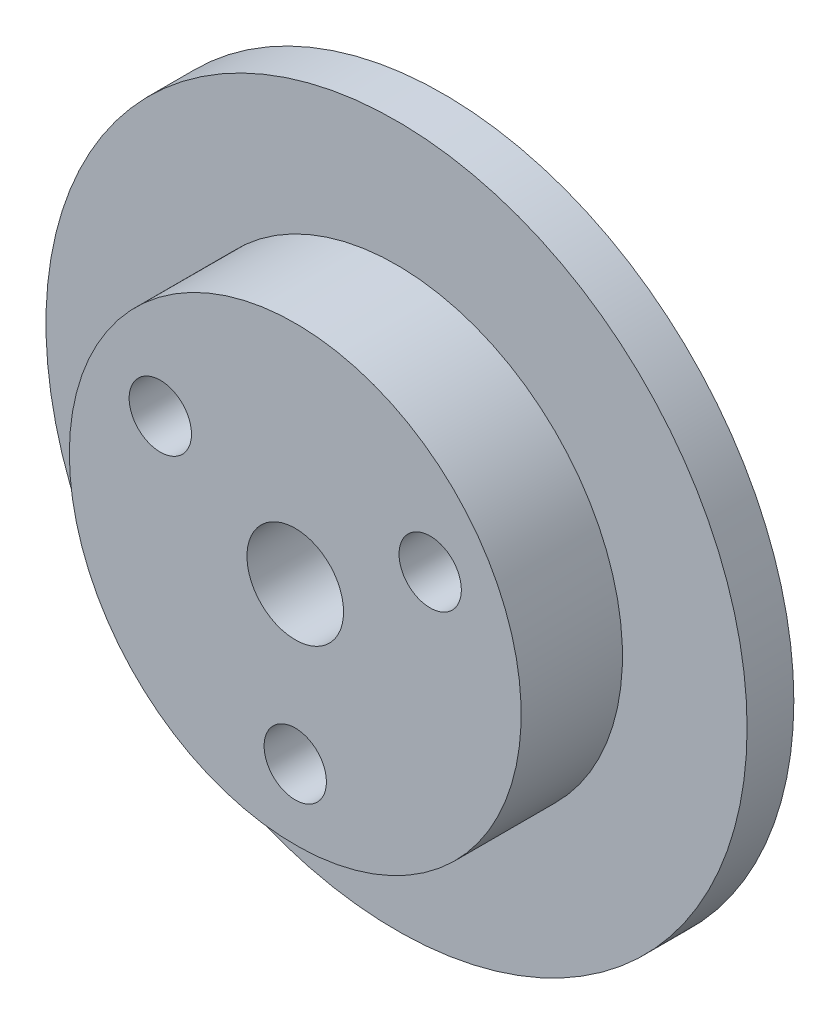
ISO-10303-21;
HEADER;
FILE_DESCRIPTION(('STEP AP214'),'2;1');
FILE_NAME('part.step','',(''),(''),'','','');
FILE_SCHEMA(('AUTOMOTIVE_DESIGN { 1 0 10303 214 1 1 1 1 }'));
ENDSEC;
DATA;
#1=APPLICATION_CONTEXT('core data for automotive mechanical design processes');
#2=APPLICATION_PROTOCOL_DEFINITION('international standard','automotive_design',2000,#1);
#3=PRODUCT_CONTEXT('',#1,'mechanical');
#4=PRODUCT('Part','Part','',(#3));
#5=PRODUCT_RELATED_PRODUCT_CATEGORY('part','',(#4));
#6=PRODUCT_DEFINITION_FORMATION('','',#4);
#7=PRODUCT_DEFINITION_CONTEXT('part definition',#1,'design');
#8=PRODUCT_DEFINITION('design','',#6,#7);
#9=PRODUCT_DEFINITION_SHAPE('','',#8);
#10=(LENGTH_UNIT() NAMED_UNIT(*) SI_UNIT(.MILLI.,.METRE.));
#11=(NAMED_UNIT(*) PLANE_ANGLE_UNIT() SI_UNIT($,.RADIAN.));
#12=(NAMED_UNIT(*) SI_UNIT($,.STERADIAN.) SOLID_ANGLE_UNIT());
#13=UNCERTAINTY_MEASURE_WITH_UNIT(LENGTH_MEASURE(1.E-05),#10,'distance_accuracy_value','');
#14=(GEOMETRIC_REPRESENTATION_CONTEXT(3) GLOBAL_UNCERTAINTY_ASSIGNED_CONTEXT((#13)) GLOBAL_UNIT_ASSIGNED_CONTEXT((#10,
#11,#12)) REPRESENTATION_CONTEXT('',''));
#15=CARTESIAN_POINT('',(0.,0.,0.));
#16=DIRECTION('',(0.,0.,1.));
#17=DIRECTION('',(1.,0.,0.));
#18=AXIS2_PLACEMENT_3D('',#15,#16,#17);
#19=CARTESIAN_POINT('',(0.,0.,3.));
#20=DIRECTION('',(0.,0.,-1.));
#21=DIRECTION('',(-1.,0.,0.));
#22=AXIS2_PLACEMENT_3D('',#19,#20,#21);
#23=CYLINDRICAL_SURFACE('',#22,22.5);
#24=CARTESIAN_POINT('',(0.,0.,3.));
#25=DIRECTION('',(0.,0.,1.));
#26=DIRECTION('',(1.,0.,0.));
#27=AXIS2_PLACEMENT_3D('',#24,#25,#26);
#28=CIRCLE('',#27,22.5);
#29=CARTESIAN_POINT('',(22.5,0.,3.));
#30=VERTEX_POINT('',#29);
#31=EDGE_CURVE('E10',#30,#30,#28,.T.);
#32=ORIENTED_EDGE('',*,*,#31,.F.);
#33=EDGE_LOOP('',(#32));
#34=FACE_BOUND('',#33,.T.);
#35=CARTESIAN_POINT('',(0.,0.,0.));
#36=DIRECTION('',(0.,0.,1.));
#37=DIRECTION('',(1.,0.,0.));
#38=AXIS2_PLACEMENT_3D('',#35,#36,#37);
#39=CIRCLE('',#38,22.5);
#40=CARTESIAN_POINT('',(22.5,0.,0.));
#41=VERTEX_POINT('',#40);
#42=EDGE_CURVE('E34',#41,#41,#39,.T.);
#43=ORIENTED_EDGE('',*,*,#42,.T.);
#44=EDGE_LOOP('',(#43));
#45=FACE_BOUND('',#44,.T.);
#46=ADVANCED_FACE('F31',(#34,#45),#23,.T.);
#47=CARTESIAN_POINT('',(0.,0.,3.));
#48=DIRECTION('',(0.,0.,1.));
#49=DIRECTION('',(1.,0.,0.));
#50=AXIS2_PLACEMENT_3D('',#47,#48,#49);
#51=PLANE('',#50);
#52=CARTESIAN_POINT('',(0.,0.,3.));
#53=DIRECTION('',(0.,0.,1.));
#54=DIRECTION('',(1.,0.,0.));
#55=AXIS2_PLACEMENT_3D('',#52,#53,#54);
#56=CIRCLE('',#55,14.5);
#57=CARTESIAN_POINT('',(-14.5,0.,3.));
#58=VERTEX_POINT('',#57);
#59=EDGE_CURVE('E43',#58,#58,#56,.T.);
#60=ORIENTED_EDGE('',*,*,#59,.F.);
#61=EDGE_LOOP('',(#60));
#62=FACE_BOUND('',#61,.T.);
#63=ORIENTED_EDGE('',*,*,#31,.T.);
#64=EDGE_LOOP('',(#63));
#65=FACE_BOUND('',#64,.T.);
#66=ADVANCED_FACE('F102',(#62,#65),#51,.T.);
#67=CARTESIAN_POINT('',(0.,0.,0.));
#68=DIRECTION('',(0.,0.,1.));
#69=DIRECTION('',(1.,0.,0.));
#70=AXIS2_PLACEMENT_3D('',#67,#68,#69);
#71=PLANE('',#70);
#72=CARTESIAN_POINT('',(-8.66025403784436,5.00000000000004,0.));
#73=DIRECTION('',(0.,0.,1.));
#74=DIRECTION('',(1.,0.,0.));
#75=AXIS2_PLACEMENT_3D('',#72,#73,#74);
#76=CIRCLE('',#75,2.);
#77=CARTESIAN_POINT('',(-6.66025403784436,5.00000000000004,0.));
#78=VERTEX_POINT('',#77);
#79=EDGE_CURVE('E52',#78,#78,#76,.T.);
#80=ORIENTED_EDGE('',*,*,#79,.T.);
#81=EDGE_LOOP('',(#80));
#82=FACE_BOUND('',#81,.T.);
#83=CARTESIAN_POINT('',(0.,-10.,0.));
#84=DIRECTION('',(0.,0.,1.));
#85=DIRECTION('',(1.,0.,0.));
#86=AXIS2_PLACEMENT_3D('',#83,#84,#85);
#87=CIRCLE('',#86,2.);
#88=CARTESIAN_POINT('',(2.,-10.,0.));
#89=VERTEX_POINT('',#88);
#90=EDGE_CURVE('E64',#89,#89,#87,.T.);
#91=ORIENTED_EDGE('',*,*,#90,.T.);
#92=EDGE_LOOP('',(#91));
#93=FACE_BOUND('',#92,.T.);
#94=CARTESIAN_POINT('',(0.,0.,0.));
#95=DIRECTION('',(0.,0.,1.));
#96=DIRECTION('',(1.,0.,0.));
#97=AXIS2_PLACEMENT_3D('',#94,#95,#96);
#98=CIRCLE('',#97,3.1);
#99=CARTESIAN_POINT('',(3.1,0.,0.));
#100=VERTEX_POINT('',#99);
#101=EDGE_CURVE('E58',#100,#100,#98,.T.);
#102=ORIENTED_EDGE('',*,*,#101,.T.);
#103=EDGE_LOOP('',(#102));
#104=FACE_BOUND('',#103,.T.);
#105=CARTESIAN_POINT('',(8.66025403784436,5.00000000000004,0.));
#106=DIRECTION('',(0.,0.,1.));
#107=DIRECTION('',(1.,0.,0.));
#108=AXIS2_PLACEMENT_3D('',#105,#106,#107);
#109=CIRCLE('',#108,2.);
#110=CARTESIAN_POINT('',(10.6602540378444,5.00000000000004,0.));
#111=VERTEX_POINT('',#110);
#112=EDGE_CURVE('E46',#111,#111,#109,.T.);
#113=ORIENTED_EDGE('',*,*,#112,.T.);
#114=EDGE_LOOP('',(#113));
#115=FACE_BOUND('',#114,.T.);
#116=ORIENTED_EDGE('',*,*,#42,.F.);
#117=EDGE_LOOP('',(#116));
#118=FACE_BOUND('',#117,.T.);
#119=ADVANCED_FACE('F73',(#82,#93,#104,#115,#118),#71,.F.);
#120=CARTESIAN_POINT('',(0.,0.,9.5));
#121=DIRECTION('',(0.,0.,-1.));
#122=DIRECTION('',(-1.,0.,0.));
#123=AXIS2_PLACEMENT_3D('',#120,#121,#122);
#124=CYLINDRICAL_SURFACE('',#123,14.5);
#125=CARTESIAN_POINT('',(0.,0.,9.5));
#126=DIRECTION('',(0.,0.,1.));
#127=DIRECTION('',(1.,0.,0.));
#128=AXIS2_PLACEMENT_3D('',#125,#126,#127);
#129=CIRCLE('',#128,14.5);
#130=CARTESIAN_POINT('',(-14.5,0.,9.5));
#131=VERTEX_POINT('',#130);
#132=EDGE_CURVE('E41',#131,#131,#129,.T.);
#133=CARTESIAN_POINT('',(-14.5,0.,9.5));
#134=CARTESIAN_POINT('',(-14.5,0.,9.43229166666667));
#135=CARTESIAN_POINT('',(-14.5,0.,9.36458333333333));
#136=CARTESIAN_POINT('',(-14.5,0.,9.22916666666667));
#137=CARTESIAN_POINT('',(-14.5,0.,9.16145833333333));
#138=CARTESIAN_POINT('',(-14.5,0.,9.02604166666667));
#139=CARTESIAN_POINT('',(-14.5,0.,8.95833333333333));
#140=CARTESIAN_POINT('',(-14.5,0.,8.82291666666667));
#141=CARTESIAN_POINT('',(-14.5,0.,8.75520833333333));
#142=CARTESIAN_POINT('',(-14.5,0.,8.61979166666667));
#143=CARTESIAN_POINT('',(-14.5,0.,8.55208333333333));
#144=CARTESIAN_POINT('',(-14.5,0.,8.41666666666667));
#145=CARTESIAN_POINT('',(-14.5,0.,8.34895833333333));
#146=CARTESIAN_POINT('',(-14.5,0.,8.21354166666667));
#147=CARTESIAN_POINT('',(-14.5,0.,8.14583333333333));
#148=CARTESIAN_POINT('',(-14.5,0.,8.01041666666667));
#149=CARTESIAN_POINT('',(-14.5,0.,7.94270833333333));
#150=CARTESIAN_POINT('',(-14.5,0.,7.80729166666667));
#151=CARTESIAN_POINT('',(-14.5,0.,7.73958333333333));
#152=CARTESIAN_POINT('',(-14.5,0.,7.60416666666667));
#153=CARTESIAN_POINT('',(-14.5,0.,7.53645833333333));
#154=CARTESIAN_POINT('',(-14.5,0.,7.40104166666667));
#155=CARTESIAN_POINT('',(-14.5,0.,7.33333333333333));
#156=CARTESIAN_POINT('',(-14.5,0.,7.19791666666667));
#157=CARTESIAN_POINT('',(-14.5,0.,7.13020833333333));
#158=CARTESIAN_POINT('',(-14.5,0.,6.99479166666667));
#159=CARTESIAN_POINT('',(-14.5,0.,6.92708333333333));
#160=CARTESIAN_POINT('',(-14.5,0.,6.79166666666667));
#161=CARTESIAN_POINT('',(-14.5,0.,6.72395833333333));
#162=CARTESIAN_POINT('',(-14.5,0.,6.58854166666667));
#163=CARTESIAN_POINT('',(-14.5,0.,6.52083333333333));
#164=CARTESIAN_POINT('',(-14.5,0.,6.38541666666667));
#165=CARTESIAN_POINT('',(-14.5,0.,6.31770833333333));
#166=CARTESIAN_POINT('',(-14.5,0.,6.18229166666667));
#167=CARTESIAN_POINT('',(-14.5,0.,6.11458333333333));
#168=CARTESIAN_POINT('',(-14.5,0.,5.97916666666667));
#169=CARTESIAN_POINT('',(-14.5,0.,5.91145833333333));
#170=CARTESIAN_POINT('',(-14.5,0.,5.77604166666667));
#171=CARTESIAN_POINT('',(-14.5,0.,5.70833333333333));
#172=CARTESIAN_POINT('',(-14.5,0.,5.57291666666667));
#173=CARTESIAN_POINT('',(-14.5,0.,5.50520833333333));
#174=CARTESIAN_POINT('',(-14.5,0.,5.36979166666667));
#175=CARTESIAN_POINT('',(-14.5,0.,5.30208333333333));
#176=CARTESIAN_POINT('',(-14.5,0.,5.16666666666667));
#177=CARTESIAN_POINT('',(-14.5,0.,5.09895833333333));
#178=CARTESIAN_POINT('',(-14.5,0.,4.96354166666667));
#179=CARTESIAN_POINT('',(-14.5,0.,4.89583333333333));
#180=CARTESIAN_POINT('',(-14.5,0.,4.76041666666667));
#181=CARTESIAN_POINT('',(-14.5,0.,4.69270833333333));
#182=CARTESIAN_POINT('',(-14.5,0.,4.55729166666667));
#183=CARTESIAN_POINT('',(-14.5,0.,4.48958333333333));
#184=CARTESIAN_POINT('',(-14.5,0.,4.35416666666667));
#185=CARTESIAN_POINT('',(-14.5,0.,4.28645833333333));
#186=CARTESIAN_POINT('',(-14.5,0.,4.15104166666667));
#187=CARTESIAN_POINT('',(-14.5,0.,4.08333333333333));
#188=CARTESIAN_POINT('',(-14.5,0.,3.94791666666667));
#189=CARTESIAN_POINT('',(-14.5,0.,3.88020833333333));
#190=CARTESIAN_POINT('',(-14.5,0.,3.74479166666667));
#191=CARTESIAN_POINT('',(-14.5,0.,3.67708333333333));
#192=CARTESIAN_POINT('',(-14.5,0.,3.54166666666667));
#193=CARTESIAN_POINT('',(-14.5,0.,3.47395833333333));
#194=CARTESIAN_POINT('',(-14.5,0.,3.33854166666667));
#195=CARTESIAN_POINT('',(-14.5,0.,3.27083333333333));
#196=CARTESIAN_POINT('',(-14.5,0.,3.13541666666667));
#197=CARTESIAN_POINT('',(-14.5,0.,3.06770833333333));
#198=CARTESIAN_POINT('',(-14.5,0.,3.));
#199=B_SPLINE_CURVE_WITH_KNOTS('',3,(#133,#134,#135,#136,#137,#138,#139,#140,#141,#142,#143,
#144,#145,#146,#147,#148,#149,#150,#151,#152,#153,#154,#155,#156,#157,#158,#159,#160,#161,#162,
#163,#164,#165,#166,#167,#168,#169,#170,#171,#172,#173,#174,#175,#176,#177,#178,#179,#180,#181,
#182,#183,#184,#185,#186,#187,#188,#189,#190,#191,#192,#193,#194,#195,#196,#197,#198),
.UNSPECIFIED.,.F.,.F.,(4,2,2,2,2,2,2,2,2,2,2,2,2,2,2,2,2,2,2,2,2,2,2,2,2,2,2,2,2,2,2,2,4),(0.,
0.203125,0.40625,0.609375000000001,0.812500000000001,1.015625,1.21875,1.421875,1.625,1.828125,
2.03125,2.234375,2.4375,2.640625,2.84375,3.046875,3.25,3.453125,3.65625,3.859375,4.0625,
4.265625,4.46875,4.671875,4.875,5.078125,5.28125,5.484375,5.6875,5.890625,6.09375,6.296875,6.5),.UNSPECIFIED.);
#200=EDGE_CURVE('BSEAM87',#131,#58,#199,.T.);
#201=ORIENTED_EDGE('',*,*,#132,.F.);
#202=ORIENTED_EDGE('',*,*,#59,.T.);
#203=ORIENTED_EDGE('',*,*,#200,.T.);
#204=ORIENTED_EDGE('',*,*,#200,.F.);
#205=EDGE_LOOP('',(#201,#203,#202,#204));
#206=FACE_BOUND('',#205,.T.);
#207=ADVANCED_FACE('F87',(#206),#124,.T.);
#208=CARTESIAN_POINT('',(0.,0.,9.5));
#209=DIRECTION('',(0.,0.,1.));
#210=DIRECTION('',(1.,0.,0.));
#211=AXIS2_PLACEMENT_3D('',#208,#209,#210);
#212=PLANE('',#211);
#213=CARTESIAN_POINT('',(-8.66025403784436,5.00000000000004,9.5));
#214=DIRECTION('',(0.,0.,1.));
#215=DIRECTION('',(1.,0.,0.));
#216=AXIS2_PLACEMENT_3D('',#213,#214,#215);
#217=CIRCLE('',#216,2.);
#218=CARTESIAN_POINT('',(-6.66025403784436,5.00000000000004,9.5));
#219=VERTEX_POINT('',#218);
#220=EDGE_CURVE('E67',#219,#219,#217,.T.);
#221=ORIENTED_EDGE('',*,*,#220,.F.);
#222=EDGE_LOOP('',(#221));
#223=FACE_BOUND('',#222,.T.);
#224=CARTESIAN_POINT('',(0.,-10.,9.5));
#225=DIRECTION('',(0.,0.,1.));
#226=DIRECTION('',(1.,0.,0.));
#227=AXIS2_PLACEMENT_3D('',#224,#225,#226);
#228=CIRCLE('',#227,2.);
#229=CARTESIAN_POINT('',(2.,-10.,9.5));
#230=VERTEX_POINT('',#229);
#231=EDGE_CURVE('E61',#230,#230,#228,.T.);
#232=ORIENTED_EDGE('',*,*,#231,.F.);
#233=EDGE_LOOP('',(#232));
#234=FACE_BOUND('',#233,.T.);
#235=CARTESIAN_POINT('',(0.,0.,9.5));
#236=DIRECTION('',(0.,0.,1.));
#237=DIRECTION('',(1.,0.,0.));
#238=AXIS2_PLACEMENT_3D('',#235,#236,#237);
#239=CIRCLE('',#238,3.1);
#240=CARTESIAN_POINT('',(3.1,0.,9.5));
#241=VERTEX_POINT('',#240);
#242=EDGE_CURVE('E55',#241,#241,#239,.T.);
#243=ORIENTED_EDGE('',*,*,#242,.F.);
#244=EDGE_LOOP('',(#243));
#245=FACE_BOUND('',#244,.T.);
#246=CARTESIAN_POINT('',(8.66025403784436,5.00000000000004,9.5));
#247=DIRECTION('',(0.,0.,1.));
#248=DIRECTION('',(1.,0.,0.));
#249=AXIS2_PLACEMENT_3D('',#246,#247,#248);
#250=CIRCLE('',#249,2.);
#251=CARTESIAN_POINT('',(10.6602540378444,5.00000000000004,9.5));
#252=VERTEX_POINT('',#251);
#253=EDGE_CURVE('E49',#252,#252,#250,.T.);
#254=ORIENTED_EDGE('',*,*,#253,.F.);
#255=EDGE_LOOP('',(#254));
#256=FACE_BOUND('',#255,.T.);
#257=ORIENTED_EDGE('',*,*,#132,.T.);
#258=EDGE_LOOP('',(#257));
#259=FACE_BOUND('',#258,.T.);
#260=ADVANCED_FACE('F83',(#223,#234,#245,#256,#259),#212,.T.);
#261=CARTESIAN_POINT('',(8.66025403784436,5.00000000000004,0.));
#262=DIRECTION('',(0.,0.,1.));
#263=DIRECTION('',(1.,0.,0.));
#264=AXIS2_PLACEMENT_3D('',#261,#262,#263);
#265=CYLINDRICAL_SURFACE('',#264,2.);
#266=ORIENTED_EDGE('',*,*,#112,.F.);
#267=EDGE_LOOP('',(#266));
#268=FACE_BOUND('',#267,.T.);
#269=ORIENTED_EDGE('',*,*,#253,.T.);
#270=EDGE_LOOP('',(#269));
#271=FACE_BOUND('',#270,.T.);
#272=ADVANCED_FACE('F86',(#268,#271),#265,.F.);
#273=CARTESIAN_POINT('',(0.,0.,0.));
#274=DIRECTION('',(0.,0.,1.));
#275=DIRECTION('',(1.,0.,0.));
#276=AXIS2_PLACEMENT_3D('',#273,#274,#275);
#277=CYLINDRICAL_SURFACE('',#276,3.1);
#278=ORIENTED_EDGE('',*,*,#101,.F.);
#279=EDGE_LOOP('',(#278));
#280=FACE_BOUND('',#279,.T.);
#281=ORIENTED_EDGE('',*,*,#242,.T.);
#282=EDGE_LOOP('',(#281));
#283=FACE_BOUND('',#282,.T.);
#284=ADVANCED_FACE('F113',(#280,#283),#277,.F.);
#285=CARTESIAN_POINT('',(0.,-10.,0.));
#286=DIRECTION('',(0.,0.,1.));
#287=DIRECTION('',(1.,0.,0.));
#288=AXIS2_PLACEMENT_3D('',#285,#286,#287);
#289=CYLINDRICAL_SURFACE('',#288,2.);
#290=ORIENTED_EDGE('',*,*,#90,.F.);
#291=EDGE_LOOP('',(#290));
#292=FACE_BOUND('',#291,.T.);
#293=ORIENTED_EDGE('',*,*,#231,.T.);
#294=EDGE_LOOP('',(#293));
#295=FACE_BOUND('',#294,.T.);
#296=ADVANCED_FACE('F79',(#292,#295),#289,.F.);
#297=CARTESIAN_POINT('',(-8.66025403784436,5.00000000000004,0.));
#298=DIRECTION('',(0.,0.,1.));
#299=DIRECTION('',(1.,0.,0.));
#300=AXIS2_PLACEMENT_3D('',#297,#298,#299);
#301=CYLINDRICAL_SURFACE('',#300,2.);
#302=ORIENTED_EDGE('',*,*,#79,.F.);
#303=EDGE_LOOP('',(#302));
#304=FACE_BOUND('',#303,.T.);
#305=ORIENTED_EDGE('',*,*,#220,.T.);
#306=EDGE_LOOP('',(#305));
#307=FACE_BOUND('',#306,.T.);
#308=ADVANCED_FACE('F76',(#304,#307),#301,.F.);
#309=CLOSED_SHELL('',(#46,#66,#119,#207,#260,#272,#284,#296,#308));
#310=MANIFOLD_SOLID_BREP('B2',#309);
#311=ADVANCED_BREP_SHAPE_REPRESENTATION('',(#18,#310),#14);
#312=SHAPE_DEFINITION_REPRESENTATION(#9,#311);
ENDSEC;
END-ISO-10303-21;
